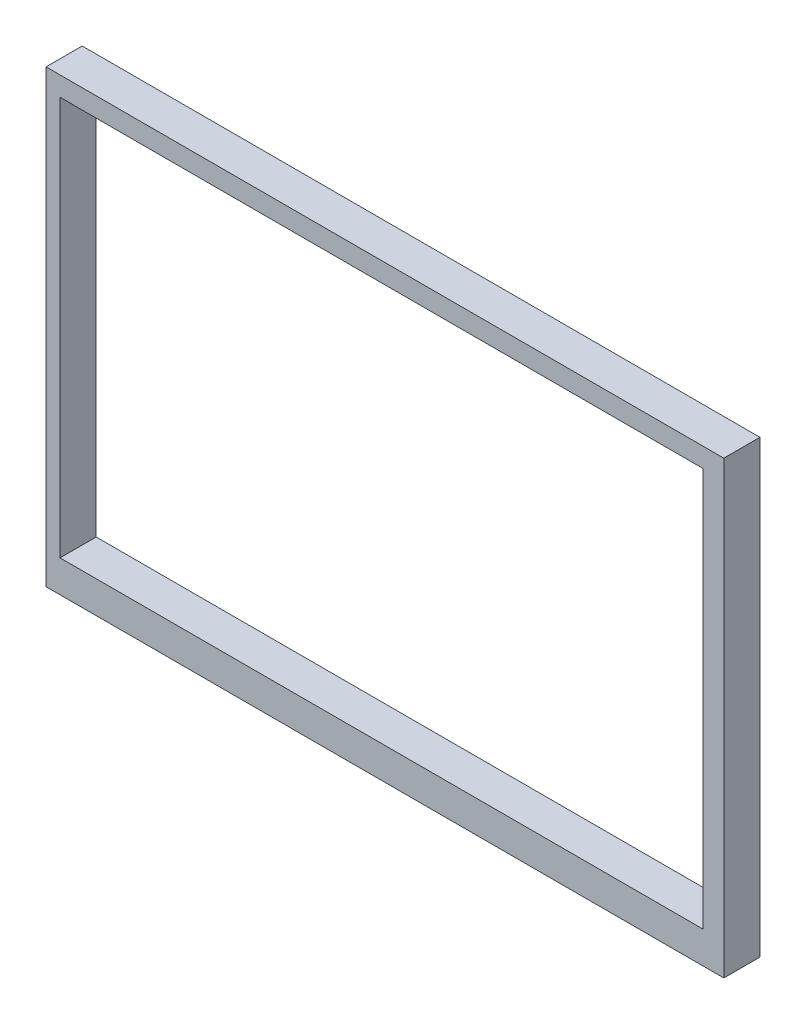
ISO-10303-21;
HEADER;
FILE_DESCRIPTION(('STEP AP214'),'2;1');
FILE_NAME('part.step','',(''),(''),'','','');
FILE_SCHEMA(('AUTOMOTIVE_DESIGN { 1 0 10303 214 1 1 1 1 }'));
ENDSEC;
DATA;
#1=APPLICATION_CONTEXT('core data for automotive mechanical design processes');
#2=APPLICATION_PROTOCOL_DEFINITION('international standard','automotive_design',2000,#1);
#3=PRODUCT_CONTEXT('',#1,'mechanical');
#4=PRODUCT('Part','Part','',(#3));
#5=PRODUCT_RELATED_PRODUCT_CATEGORY('part','',(#4));
#6=PRODUCT_DEFINITION_FORMATION('','',#4);
#7=PRODUCT_DEFINITION_CONTEXT('part definition',#1,'design');
#8=PRODUCT_DEFINITION('design','',#6,#7);
#9=PRODUCT_DEFINITION_SHAPE('','',#8);
#10=(LENGTH_UNIT() NAMED_UNIT(*) SI_UNIT(.MILLI.,.METRE.));
#11=(NAMED_UNIT(*) PLANE_ANGLE_UNIT() SI_UNIT($,.RADIAN.));
#12=(NAMED_UNIT(*) SI_UNIT($,.STERADIAN.) SOLID_ANGLE_UNIT());
#13=UNCERTAINTY_MEASURE_WITH_UNIT(LENGTH_MEASURE(1.E-05),#10,'distance_accuracy_value','');
#14=(GEOMETRIC_REPRESENTATION_CONTEXT(3) GLOBAL_UNCERTAINTY_ASSIGNED_CONTEXT((#13)) GLOBAL_UNIT_ASSIGNED_CONTEXT((#10,
#11,#12)) REPRESENTATION_CONTEXT('',''));
#15=CARTESIAN_POINT('',(0.,0.,0.));
#16=DIRECTION('',(0.,0.,1.));
#17=DIRECTION('',(1.,0.,0.));
#18=AXIS2_PLACEMENT_3D('',#15,#16,#17);
#19=CARTESIAN_POINT('',(0.,0.,5.));
#20=DIRECTION('',(0.,0.,1.));
#21=DIRECTION('',(1.,0.,0.));
#22=AXIS2_PLACEMENT_3D('',#19,#20,#21);
#23=PLANE('',#22);
#24=DIRECTION('',(0.,-1.,0.));
#25=VECTOR('',#24,1.);
#26=CARTESIAN_POINT('',(-48.6960708782743,35.6856702619415,5.));
#27=LINE('',#26,#25);
#28=CARTESIAN_POINT('',(-48.6960708782743,35.6856702619415,5.));
#29=VERTEX_POINT('',#28);
#30=CARTESIAN_POINT('',(-48.6960708782743,-26.615562403698,5.));
#31=VERTEX_POINT('',#30);
#32=EDGE_CURVE('E159',#29,#31,#27,.T.);
#33=ORIENTED_EDGE('',*,*,#32,.T.);
#34=DIRECTION('',(1.,0.,0.));
#35=VECTOR('',#34,1.);
#36=CARTESIAN_POINT('',(-48.6960708782743,-26.615562403698,5.));
#37=LINE('',#36,#35);
#38=CARTESIAN_POINT('',(45.0909350027677,-26.615562403698,5.));
#39=VERTEX_POINT('',#38);
#40=EDGE_CURVE('E163',#31,#39,#37,.T.);
#41=ORIENTED_EDGE('',*,*,#40,.T.);
#42=DIRECTION('',(0.,1.,0.));
#43=VECTOR('',#42,1.);
#44=CARTESIAN_POINT('',(45.0909350027677,35.6856702619415,5.));
#45=LINE('',#44,#43);
#46=CARTESIAN_POINT('',(45.0909350027677,35.6856702619415,5.));
#47=VERTEX_POINT('',#46);
#48=EDGE_CURVE('E167',#39,#47,#45,.T.);
#49=ORIENTED_EDGE('',*,*,#48,.T.);
#50=DIRECTION('',(-1.,0.,0.));
#51=VECTOR('',#50,1.);
#52=CARTESIAN_POINT('',(-48.6960708782743,35.6856702619415,5.));
#53=LINE('',#52,#51);
#54=EDGE_CURVE('E170',#47,#29,#53,.T.);
#55=ORIENTED_EDGE('',*,*,#54,.T.);
#56=EDGE_LOOP('',(#33,#41,#49,#55));
#57=FACE_BOUND('',#56,.T.);
#58=DIRECTION('',(1.,0.,0.));
#59=VECTOR('',#58,1.);
#60=CARTESIAN_POINT('',(-46.7630970724191,-22.1907550077042,5.));
#61=LINE('',#60,#59);
#62=CARTESIAN_POINT('',(-46.7630970724191,-22.1907550077042,5.));
#63=VERTEX_POINT('',#62);
#64=CARTESIAN_POINT('',(42.2369029275809,-22.1907550077042,5.));
#65=VERTEX_POINT('',#64);
#66=EDGE_CURVE('E120',#63,#65,#61,.T.);
#67=ORIENTED_EDGE('',*,*,#66,.F.);
#68=DIRECTION('',(0.,-1.,0.));
#69=VECTOR('',#68,1.);
#70=CARTESIAN_POINT('',(-46.7630970724191,33.0092449922958,5.));
#71=LINE('',#70,#69);
#72=CARTESIAN_POINT('',(-46.7630970724191,33.0092449922958,5.));
#73=VERTEX_POINT('',#72);
#74=EDGE_CURVE('E111',#73,#63,#71,.T.);
#75=ORIENTED_EDGE('',*,*,#74,.F.);
#76=DIRECTION('',(-1.,0.,0.));
#77=VECTOR('',#76,1.);
#78=CARTESIAN_POINT('',(-46.7630970724191,33.0092449922958,5.));
#79=LINE('',#78,#77);
#80=CARTESIAN_POINT('',(42.2369029275809,33.0092449922958,5.));
#81=VERTEX_POINT('',#80);
#82=EDGE_CURVE('E137',#81,#73,#79,.T.);
#83=ORIENTED_EDGE('',*,*,#82,.F.);
#84=DIRECTION('',(0.,1.,0.));
#85=VECTOR('',#84,1.);
#86=CARTESIAN_POINT('',(42.2369029275809,33.0092449922958,5.));
#87=LINE('',#86,#85);
#88=EDGE_CURVE('E133',#65,#81,#87,.T.);
#89=ORIENTED_EDGE('',*,*,#88,.F.);
#90=EDGE_LOOP('',(#67,#75,#83,#89));
#91=FACE_BOUND('',#90,.T.);
#92=ADVANCED_FACE('F45',(#57,#91),#23,.T.);
#93=CARTESIAN_POINT('',(0.,0.,0.));
#94=DIRECTION('',(0.,0.,1.));
#95=DIRECTION('',(1.,0.,0.));
#96=AXIS2_PLACEMENT_3D('',#93,#94,#95);
#97=PLANE('',#96);
#98=DIRECTION('',(0.,-1.,0.));
#99=VECTOR('',#98,1.);
#100=CARTESIAN_POINT('',(-48.6960708782743,35.6856702619415,0.));
#101=LINE('',#100,#99);
#102=CARTESIAN_POINT('',(-48.6960708782743,35.6856702619415,0.));
#103=VERTEX_POINT('',#102);
#104=CARTESIAN_POINT('',(-48.6960708782743,-26.615562403698,0.));
#105=VERTEX_POINT('',#104);
#106=EDGE_CURVE('E129',#103,#105,#101,.T.);
#107=ORIENTED_EDGE('',*,*,#106,.F.);
#108=DIRECTION('',(-1.,0.,0.));
#109=VECTOR('',#108,1.);
#110=CARTESIAN_POINT('',(-48.6960708782743,35.6856702619415,0.));
#111=LINE('',#110,#109);
#112=CARTESIAN_POINT('',(45.0909350027677,35.6856702619415,0.));
#113=VERTEX_POINT('',#112);
#114=EDGE_CURVE('E164',#113,#103,#111,.T.);
#115=ORIENTED_EDGE('',*,*,#114,.F.);
#116=DIRECTION('',(0.,1.,0.));
#117=VECTOR('',#116,1.);
#118=CARTESIAN_POINT('',(45.0909350027677,35.6856702619415,0.));
#119=LINE('',#118,#117);
#120=CARTESIAN_POINT('',(45.0909350027677,-26.615562403698,0.));
#121=VERTEX_POINT('',#120);
#122=EDGE_CURVE('E180',#121,#113,#119,.T.);
#123=ORIENTED_EDGE('',*,*,#122,.F.);
#124=DIRECTION('',(1.,0.,0.));
#125=VECTOR('',#124,1.);
#126=CARTESIAN_POINT('',(-48.6960708782743,-26.615562403698,0.));
#127=LINE('',#126,#125);
#128=EDGE_CURVE('E177',#105,#121,#127,.T.);
#129=ORIENTED_EDGE('',*,*,#128,.F.);
#130=EDGE_LOOP('',(#107,#115,#123,#129));
#131=FACE_BOUND('',#130,.T.);
#132=DIRECTION('',(0.,-1.,0.));
#133=VECTOR('',#132,1.);
#134=CARTESIAN_POINT('',(-46.7630970724191,33.0092449922958,0.));
#135=LINE('',#134,#133);
#136=CARTESIAN_POINT('',(-46.7630970724191,33.0092449922958,0.));
#137=VERTEX_POINT('',#136);
#138=CARTESIAN_POINT('',(-46.7630970724191,-22.1907550077042,0.));
#139=VERTEX_POINT('',#138);
#140=EDGE_CURVE('E69',#137,#139,#135,.T.);
#141=ORIENTED_EDGE('',*,*,#140,.T.);
#142=DIRECTION('',(1.,0.,0.));
#143=VECTOR('',#142,1.);
#144=CARTESIAN_POINT('',(-46.7630970724191,-22.1907550077042,0.));
#145=LINE('',#144,#143);
#146=CARTESIAN_POINT('',(42.2369029275809,-22.1907550077042,0.));
#147=VERTEX_POINT('',#146);
#148=EDGE_CURVE('E127',#139,#147,#145,.T.);
#149=ORIENTED_EDGE('',*,*,#148,.T.);
#150=DIRECTION('',(0.,1.,0.));
#151=VECTOR('',#150,1.);
#152=CARTESIAN_POINT('',(42.2369029275809,33.0092449922958,0.));
#153=LINE('',#152,#151);
#154=CARTESIAN_POINT('',(42.2369029275809,33.0092449922958,0.));
#155=VERTEX_POINT('',#154);
#156=EDGE_CURVE('E146',#147,#155,#153,.T.);
#157=ORIENTED_EDGE('',*,*,#156,.T.);
#158=DIRECTION('',(-1.,0.,0.));
#159=VECTOR('',#158,1.);
#160=CARTESIAN_POINT('',(-46.7630970724191,33.0092449922958,0.));
#161=LINE('',#160,#159);
#162=EDGE_CURVE('E121',#155,#137,#161,.T.);
#163=ORIENTED_EDGE('',*,*,#162,.T.);
#164=EDGE_LOOP('',(#141,#149,#157,#163));
#165=FACE_BOUND('',#164,.T.);
#166=ADVANCED_FACE('F203',(#131,#165),#97,.F.);
#167=CARTESIAN_POINT('',(-48.6960708782743,35.6856702619415,5.));
#168=DIRECTION('',(1.,0.,0.));
#169=DIRECTION('',(0.,0.,-1.));
#170=AXIS2_PLACEMENT_3D('',#167,#168,#169);
#171=PLANE('',#170);
#172=ORIENTED_EDGE('',*,*,#106,.T.);
#173=DIRECTION('',(0.,0.,-1.));
#174=VECTOR('',#173,1.);
#175=CARTESIAN_POINT('',(-48.6960708782743,-26.615562403698,5.));
#176=LINE('',#175,#174);
#177=EDGE_CURVE('E11',#31,#105,#176,.T.);
#178=ORIENTED_EDGE('',*,*,#177,.F.);
#179=ORIENTED_EDGE('',*,*,#32,.F.);
#180=DIRECTION('',(0.,0.,-1.));
#181=VECTOR('',#180,1.);
#182=CARTESIAN_POINT('',(-48.6960708782743,35.6856702619415,5.));
#183=LINE('',#182,#181);
#184=EDGE_CURVE('E173',#29,#103,#183,.T.);
#185=ORIENTED_EDGE('',*,*,#184,.T.);
#186=EDGE_LOOP('',(#172,#178,#179,#185));
#187=FACE_BOUND('',#186,.T.);
#188=ADVANCED_FACE('F47',(#187),#171,.F.);
#189=CARTESIAN_POINT('',(-48.6960708782743,-26.615562403698,5.));
#190=DIRECTION('',(0.,1.,0.));
#191=DIRECTION('',(0.,0.,1.));
#192=AXIS2_PLACEMENT_3D('',#189,#190,#191);
#193=PLANE('',#192);
#194=ORIENTED_EDGE('',*,*,#128,.T.);
#195=DIRECTION('',(0.,0.,-1.));
#196=VECTOR('',#195,1.);
#197=CARTESIAN_POINT('',(45.0909350027677,-26.615562403698,5.));
#198=LINE('',#197,#196);
#199=EDGE_CURVE('E54',#39,#121,#198,.T.);
#200=ORIENTED_EDGE('',*,*,#199,.F.);
#201=ORIENTED_EDGE('',*,*,#40,.F.);
#202=ORIENTED_EDGE('',*,*,#177,.T.);
#203=EDGE_LOOP('',(#194,#200,#201,#202));
#204=FACE_BOUND('',#203,.T.);
#205=ADVANCED_FACE('F213',(#204),#193,.F.);
#206=CARTESIAN_POINT('',(45.0909350027677,35.6856702619415,5.));
#207=DIRECTION('',(-1.,0.,0.));
#208=DIRECTION('',(0.,-1.,0.));
#209=AXIS2_PLACEMENT_3D('',#206,#207,#208);
#210=PLANE('',#209);
#211=ORIENTED_EDGE('',*,*,#122,.T.);
#212=DIRECTION('',(0.,0.,-1.));
#213=VECTOR('',#212,1.);
#214=CARTESIAN_POINT('',(45.0909350027677,35.6856702619415,5.));
#215=LINE('',#214,#213);
#216=EDGE_CURVE('E188',#47,#113,#215,.T.);
#217=ORIENTED_EDGE('',*,*,#216,.F.);
#218=ORIENTED_EDGE('',*,*,#48,.F.);
#219=ORIENTED_EDGE('',*,*,#199,.T.);
#220=EDGE_LOOP('',(#211,#217,#218,#219));
#221=FACE_BOUND('',#220,.T.);
#222=ADVANCED_FACE('F197',(#221),#210,.F.);
#223=CARTESIAN_POINT('',(-48.6960708782743,35.6856702619415,5.));
#224=DIRECTION('',(0.,-1.,0.));
#225=DIRECTION('',(0.,0.,-1.));
#226=AXIS2_PLACEMENT_3D('',#223,#224,#225);
#227=PLANE('',#226);
#228=ORIENTED_EDGE('',*,*,#114,.T.);
#229=ORIENTED_EDGE('',*,*,#184,.F.);
#230=ORIENTED_EDGE('',*,*,#54,.F.);
#231=ORIENTED_EDGE('',*,*,#216,.T.);
#232=EDGE_LOOP('',(#228,#229,#230,#231));
#233=FACE_BOUND('',#232,.T.);
#234=ADVANCED_FACE('F207',(#233),#227,.F.);
#235=CARTESIAN_POINT('',(-46.7630970724191,33.0092449922958,5.));
#236=DIRECTION('',(1.,0.,0.));
#237=DIRECTION('',(0.,0.,-1.));
#238=AXIS2_PLACEMENT_3D('',#235,#236,#237);
#239=PLANE('',#238);
#240=ORIENTED_EDGE('',*,*,#140,.F.);
#241=DIRECTION('',(0.,0.,-1.));
#242=VECTOR('',#241,1.);
#243=CARTESIAN_POINT('',(-46.7630970724191,33.0092449922958,5.));
#244=LINE('',#243,#242);
#245=EDGE_CURVE('E115',#73,#137,#244,.T.);
#246=ORIENTED_EDGE('',*,*,#245,.F.);
#247=ORIENTED_EDGE('',*,*,#74,.T.);
#248=DIRECTION('',(0.,0.,-1.));
#249=VECTOR('',#248,1.);
#250=CARTESIAN_POINT('',(-46.7630970724191,-22.1907550077042,5.));
#251=LINE('',#250,#249);
#252=EDGE_CURVE('E114',#63,#139,#251,.T.);
#253=ORIENTED_EDGE('',*,*,#252,.T.);
#254=EDGE_LOOP('',(#240,#246,#247,#253));
#255=FACE_BOUND('',#254,.T.);
#256=ADVANCED_FACE('F113',(#255),#239,.T.);
#257=CARTESIAN_POINT('',(-46.7630970724191,-22.1907550077042,5.));
#258=DIRECTION('',(0.,1.,0.));
#259=DIRECTION('',(0.,0.,1.));
#260=AXIS2_PLACEMENT_3D('',#257,#258,#259);
#261=PLANE('',#260);
#262=ORIENTED_EDGE('',*,*,#148,.F.);
#263=ORIENTED_EDGE('',*,*,#252,.F.);
#264=ORIENTED_EDGE('',*,*,#66,.T.);
#265=DIRECTION('',(0.,0.,-1.));
#266=VECTOR('',#265,1.);
#267=CARTESIAN_POINT('',(42.2369029275809,-22.1907550077042,5.));
#268=LINE('',#267,#266);
#269=EDGE_CURVE('E130',#65,#147,#268,.T.);
#270=ORIENTED_EDGE('',*,*,#269,.T.);
#271=EDGE_LOOP('',(#262,#263,#264,#270));
#272=FACE_BOUND('',#271,.T.);
#273=ADVANCED_FACE('F124',(#272),#261,.T.);
#274=CARTESIAN_POINT('',(42.2369029275809,33.0092449922958,5.));
#275=DIRECTION('',(-1.,0.,0.));
#276=DIRECTION('',(0.,0.,1.));
#277=AXIS2_PLACEMENT_3D('',#274,#275,#276);
#278=PLANE('',#277);
#279=ORIENTED_EDGE('',*,*,#156,.F.);
#280=ORIENTED_EDGE('',*,*,#269,.F.);
#281=ORIENTED_EDGE('',*,*,#88,.T.);
#282=DIRECTION('',(0.,0.,-1.));
#283=VECTOR('',#282,1.);
#284=CARTESIAN_POINT('',(42.2369029275809,33.0092449922958,5.));
#285=LINE('',#284,#283);
#286=EDGE_CURVE('E61',#81,#155,#285,.T.);
#287=ORIENTED_EDGE('',*,*,#286,.T.);
#288=EDGE_LOOP('',(#279,#280,#281,#287));
#289=FACE_BOUND('',#288,.T.);
#290=ADVANCED_FACE('F236',(#289),#278,.T.);
#291=CARTESIAN_POINT('',(-46.7630970724191,33.0092449922958,5.));
#292=DIRECTION('',(0.,-1.,0.));
#293=DIRECTION('',(0.,0.,-1.));
#294=AXIS2_PLACEMENT_3D('',#291,#292,#293);
#295=PLANE('',#294);
#296=ORIENTED_EDGE('',*,*,#162,.F.);
#297=ORIENTED_EDGE('',*,*,#286,.F.);
#298=ORIENTED_EDGE('',*,*,#82,.T.);
#299=ORIENTED_EDGE('',*,*,#245,.T.);
#300=EDGE_LOOP('',(#296,#297,#298,#299));
#301=FACE_BOUND('',#300,.T.);
#302=ADVANCED_FACE('F240',(#301),#295,.T.);
#303=CLOSED_SHELL('',(#92,#166,#188,#205,#222,#234,#256,#273,#290,#302));
#304=MANIFOLD_SOLID_BREP('B2',#303);
#305=ADVANCED_BREP_SHAPE_REPRESENTATION('',(#18,#304),#14);
#306=SHAPE_DEFINITION_REPRESENTATION(#9,#305);
ENDSEC;
END-ISO-10303-21;
